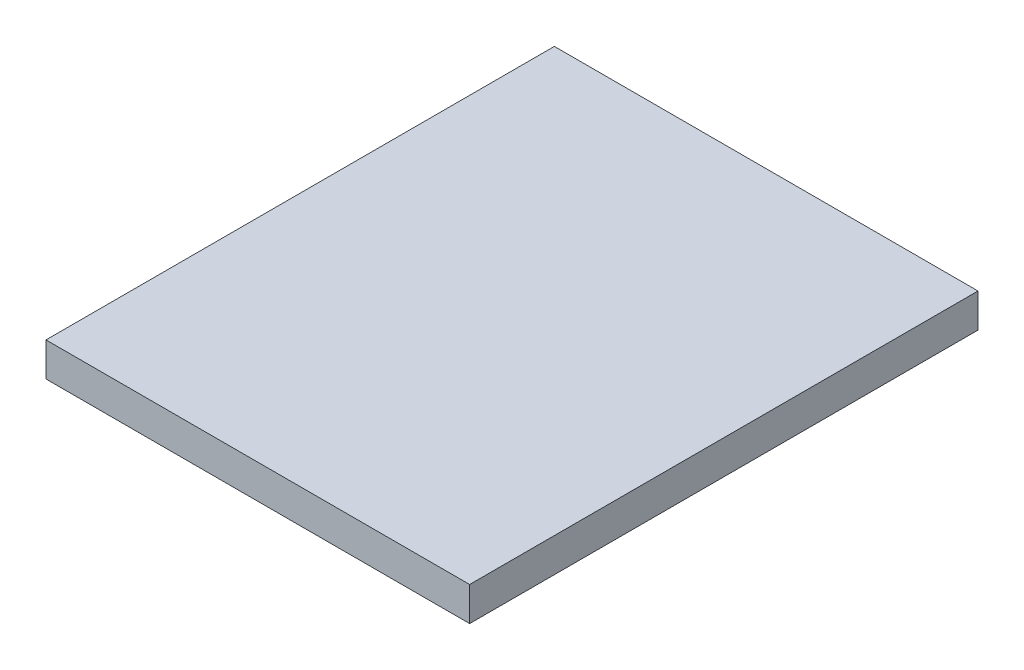
ISO-10303-21;
HEADER;
FILE_DESCRIPTION(('STEP AP214'),'2;1');
FILE_NAME('part.step','',(''),(''),'','','');
FILE_SCHEMA(('AUTOMOTIVE_DESIGN { 1 0 10303 214 1 1 1 1 }'));
ENDSEC;
DATA;
#1=APPLICATION_CONTEXT('core data for automotive mechanical design processes');
#2=APPLICATION_PROTOCOL_DEFINITION('international standard','automotive_design',2000,#1);
#3=PRODUCT_CONTEXT('',#1,'mechanical');
#4=PRODUCT('Part','Part','',(#3));
#5=PRODUCT_RELATED_PRODUCT_CATEGORY('part','',(#4));
#6=PRODUCT_DEFINITION_FORMATION('','',#4);
#7=PRODUCT_DEFINITION_CONTEXT('part definition',#1,'design');
#8=PRODUCT_DEFINITION('design','',#6,#7);
#9=PRODUCT_DEFINITION_SHAPE('','',#8);
#10=(LENGTH_UNIT() NAMED_UNIT(*) SI_UNIT(.MILLI.,.METRE.));
#11=(NAMED_UNIT(*) PLANE_ANGLE_UNIT() SI_UNIT($,.RADIAN.));
#12=(NAMED_UNIT(*) SI_UNIT($,.STERADIAN.) SOLID_ANGLE_UNIT());
#13=UNCERTAINTY_MEASURE_WITH_UNIT(LENGTH_MEASURE(1.E-05),#10,'distance_accuracy_value','');
#14=(GEOMETRIC_REPRESENTATION_CONTEXT(3) GLOBAL_UNCERTAINTY_ASSIGNED_CONTEXT((#13)) GLOBAL_UNIT_ASSIGNED_CONTEXT((#10,
#11,#12)) REPRESENTATION_CONTEXT('',''));
#15=CARTESIAN_POINT('',(0.,0.,0.));
#16=DIRECTION('',(0.,0.,1.));
#17=DIRECTION('',(1.,0.,0.));
#18=AXIS2_PLACEMENT_3D('',#15,#16,#17);
#19=CARTESIAN_POINT('',(50.,8.,-60.));
#20=DIRECTION('',(-1.,0.,0.));
#21=DIRECTION('',(0.,0.,1.));
#22=AXIS2_PLACEMENT_3D('',#19,#20,#21);
#23=PLANE('',#22);
#24=DIRECTION('',(0.,0.,-1.));
#25=VECTOR('',#24,1.);
#26=CARTESIAN_POINT('',(50.,0.,-60.));
#27=LINE('',#26,#25);
#28=CARTESIAN_POINT('',(50.,0.,60.));
#29=VERTEX_POINT('',#28);
#30=CARTESIAN_POINT('',(50.,0.,-60.));
#31=VERTEX_POINT('',#30);
#32=EDGE_CURVE('E96',#29,#31,#27,.T.);
#33=ORIENTED_EDGE('',*,*,#32,.T.);
#34=DIRECTION('',(0.,-1.,0.));
#35=VECTOR('',#34,1.);
#36=CARTESIAN_POINT('',(50.,8.,-60.));
#37=LINE('',#36,#35);
#38=CARTESIAN_POINT('',(50.,8.,-60.));
#39=VERTEX_POINT('',#38);
#40=EDGE_CURVE('E11',#39,#31,#37,.T.);
#41=ORIENTED_EDGE('',*,*,#40,.F.);
#42=DIRECTION('',(0.,0.,-1.));
#43=VECTOR('',#42,1.);
#44=CARTESIAN_POINT('',(50.,8.,-60.));
#45=LINE('',#44,#43);
#46=CARTESIAN_POINT('',(50.,8.,60.));
#47=VERTEX_POINT('',#46);
#48=EDGE_CURVE('E84',#47,#39,#45,.T.);
#49=ORIENTED_EDGE('',*,*,#48,.F.);
#50=DIRECTION('',(0.,-1.,0.));
#51=VECTOR('',#50,1.);
#52=CARTESIAN_POINT('',(50.,8.,60.));
#53=LINE('',#52,#51);
#54=EDGE_CURVE('E92',#47,#29,#53,.T.);
#55=ORIENTED_EDGE('',*,*,#54,.T.);
#56=EDGE_LOOP('',(#33,#41,#49,#55));
#57=FACE_BOUND('',#56,.T.);
#58=ADVANCED_FACE('F33',(#57),#23,.F.);
#59=CARTESIAN_POINT('',(-50.,8.,-60.));
#60=DIRECTION('',(0.,0.,1.));
#61=DIRECTION('',(1.,0.,0.));
#62=AXIS2_PLACEMENT_3D('',#59,#60,#61);
#63=PLANE('',#62);
#64=DIRECTION('',(-1.,0.,0.));
#65=VECTOR('',#64,1.);
#66=CARTESIAN_POINT('',(-50.,0.,-60.));
#67=LINE('',#66,#65);
#68=CARTESIAN_POINT('',(-50.,0.,-60.));
#69=VERTEX_POINT('',#68);
#70=EDGE_CURVE('E88',#31,#69,#67,.T.);
#71=ORIENTED_EDGE('',*,*,#70,.T.);
#72=DIRECTION('',(0.,-1.,0.));
#73=VECTOR('',#72,1.);
#74=CARTESIAN_POINT('',(-50.,8.,-60.));
#75=LINE('',#74,#73);
#76=CARTESIAN_POINT('',(-50.,8.,-60.));
#77=VERTEX_POINT('',#76);
#78=EDGE_CURVE('E41',#77,#69,#75,.T.);
#79=ORIENTED_EDGE('',*,*,#78,.F.);
#80=DIRECTION('',(-1.,0.,0.));
#81=VECTOR('',#80,1.);
#82=CARTESIAN_POINT('',(-50.,8.,-60.));
#83=LINE('',#82,#81);
#84=EDGE_CURVE('E79',#39,#77,#83,.T.);
#85=ORIENTED_EDGE('',*,*,#84,.F.);
#86=ORIENTED_EDGE('',*,*,#40,.T.);
#87=EDGE_LOOP('',(#71,#79,#85,#86));
#88=FACE_BOUND('',#87,.T.);
#89=ADVANCED_FACE('F87',(#88),#63,.F.);
#90=CARTESIAN_POINT('',(-50.,8.,-60.));
#91=DIRECTION('',(1.,0.,0.));
#92=DIRECTION('',(0.,0.,-1.));
#93=AXIS2_PLACEMENT_3D('',#90,#91,#92);
#94=PLANE('',#93);
#95=DIRECTION('',(0.,0.,1.));
#96=VECTOR('',#95,1.);
#97=CARTESIAN_POINT('',(-50.,0.,-60.));
#98=LINE('',#97,#96);
#99=CARTESIAN_POINT('',(-50.,0.,60.));
#100=VERTEX_POINT('',#99);
#101=EDGE_CURVE('E66',#69,#100,#98,.T.);
#102=ORIENTED_EDGE('',*,*,#101,.T.);
#103=DIRECTION('',(0.,-1.,0.));
#104=VECTOR('',#103,1.);
#105=CARTESIAN_POINT('',(-50.,8.,60.));
#106=LINE('',#105,#104);
#107=CARTESIAN_POINT('',(-50.,8.,60.));
#108=VERTEX_POINT('',#107);
#109=EDGE_CURVE('E89',#108,#100,#106,.T.);
#110=ORIENTED_EDGE('',*,*,#109,.F.);
#111=DIRECTION('',(0.,0.,1.));
#112=VECTOR('',#111,1.);
#113=CARTESIAN_POINT('',(-50.,8.,-60.));
#114=LINE('',#113,#112);
#115=EDGE_CURVE('E82',#77,#108,#114,.T.);
#116=ORIENTED_EDGE('',*,*,#115,.F.);
#117=ORIENTED_EDGE('',*,*,#78,.T.);
#118=EDGE_LOOP('',(#102,#110,#116,#117));
#119=FACE_BOUND('',#118,.T.);
#120=ADVANCED_FACE('F90',(#119),#94,.F.);
#121=CARTESIAN_POINT('',(-50.,8.,60.));
#122=DIRECTION('',(0.,0.,-1.));
#123=DIRECTION('',(-1.,0.,0.));
#124=AXIS2_PLACEMENT_3D('',#121,#122,#123);
#125=PLANE('',#124);
#126=DIRECTION('',(1.,0.,0.));
#127=VECTOR('',#126,1.);
#128=CARTESIAN_POINT('',(-50.,0.,60.));
#129=LINE('',#128,#127);
#130=EDGE_CURVE('E72',#100,#29,#129,.T.);
#131=ORIENTED_EDGE('',*,*,#130,.T.);
#132=ORIENTED_EDGE('',*,*,#54,.F.);
#133=DIRECTION('',(1.,0.,0.));
#134=VECTOR('',#133,1.);
#135=CARTESIAN_POINT('',(-50.,8.,60.));
#136=LINE('',#135,#134);
#137=EDGE_CURVE('E49',#108,#47,#136,.T.);
#138=ORIENTED_EDGE('',*,*,#137,.F.);
#139=ORIENTED_EDGE('',*,*,#109,.T.);
#140=EDGE_LOOP('',(#131,#132,#138,#139));
#141=FACE_BOUND('',#140,.T.);
#142=ADVANCED_FACE('F103',(#141),#125,.F.);
#143=CARTESIAN_POINT('',(0.,8.,0.));
#144=DIRECTION('',(0.,1.,0.));
#145=DIRECTION('',(0.,0.,1.));
#146=AXIS2_PLACEMENT_3D('',#143,#144,#145);
#147=PLANE('',#146);
#148=ORIENTED_EDGE('',*,*,#48,.T.);
#149=ORIENTED_EDGE('',*,*,#84,.T.);
#150=ORIENTED_EDGE('',*,*,#115,.T.);
#151=ORIENTED_EDGE('',*,*,#137,.T.);
#152=EDGE_LOOP('',(#148,#149,#150,#151));
#153=FACE_BOUND('',#152,.T.);
#154=ADVANCED_FACE('F80',(#153),#147,.T.);
#155=CARTESIAN_POINT('',(0.,0.,0.));
#156=DIRECTION('',(0.,1.,0.));
#157=DIRECTION('',(0.,0.,1.));
#158=AXIS2_PLACEMENT_3D('',#155,#156,#157);
#159=PLANE('',#158);
#160=ORIENTED_EDGE('',*,*,#32,.F.);
#161=ORIENTED_EDGE('',*,*,#130,.F.);
#162=ORIENTED_EDGE('',*,*,#101,.F.);
#163=ORIENTED_EDGE('',*,*,#70,.F.);
#164=EDGE_LOOP('',(#160,#161,#162,#163));
#165=FACE_BOUND('',#164,.T.);
#166=ADVANCED_FACE('F106',(#165),#159,.F.);
#167=CLOSED_SHELL('',(#58,#89,#120,#142,#154,#166));
#168=MANIFOLD_SOLID_BREP('B2',#167);
#169=ADVANCED_BREP_SHAPE_REPRESENTATION('',(#18,#168),#14);
#170=SHAPE_DEFINITION_REPRESENTATION(#9,#169);
ENDSEC;
END-ISO-10303-21;
